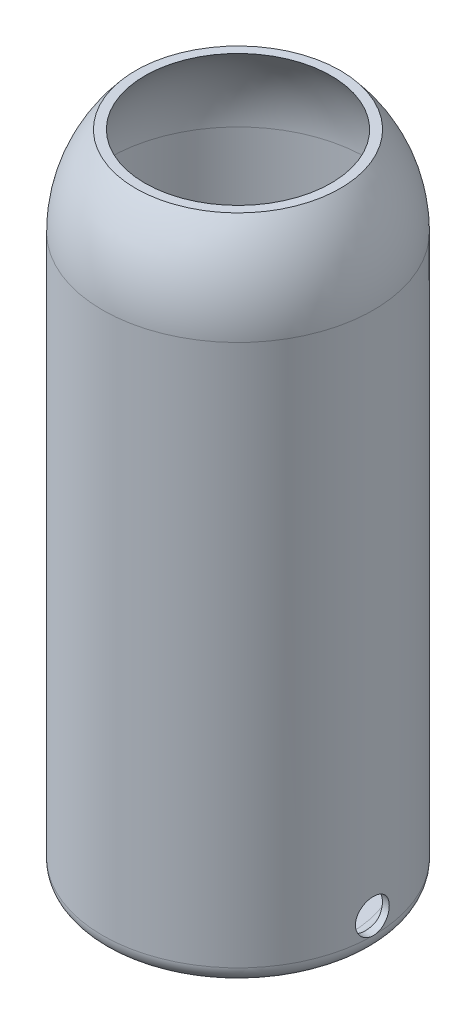
ISO-10303-21;
HEADER;
FILE_DESCRIPTION(('STEP AP214'),'2;1');
FILE_NAME('part.step','',(''),(''),'','','');
FILE_SCHEMA(('AUTOMOTIVE_DESIGN { 1 0 10303 214 1 1 1 1 }'));
ENDSEC;
DATA;
#1=APPLICATION_CONTEXT('core data for automotive mechanical design processes');
#2=APPLICATION_PROTOCOL_DEFINITION('international standard','automotive_design',2000,#1);
#3=PRODUCT_CONTEXT('',#1,'mechanical');
#4=PRODUCT('Part','Part','',(#3));
#5=PRODUCT_RELATED_PRODUCT_CATEGORY('part','',(#4));
#6=PRODUCT_DEFINITION_FORMATION('','',#4);
#7=PRODUCT_DEFINITION_CONTEXT('part definition',#1,'design');
#8=PRODUCT_DEFINITION('design','',#6,#7);
#9=PRODUCT_DEFINITION_SHAPE('','',#8);
#10=(LENGTH_UNIT() NAMED_UNIT(*) SI_UNIT(.MILLI.,.METRE.));
#11=(NAMED_UNIT(*) PLANE_ANGLE_UNIT() SI_UNIT($,.RADIAN.));
#12=(NAMED_UNIT(*) SI_UNIT($,.STERADIAN.) SOLID_ANGLE_UNIT());
#13=UNCERTAINTY_MEASURE_WITH_UNIT(LENGTH_MEASURE(1.E-05),#10,'distance_accuracy_value','');
#14=(GEOMETRIC_REPRESENTATION_CONTEXT(3) GLOBAL_UNCERTAINTY_ASSIGNED_CONTEXT((#13)) GLOBAL_UNIT_ASSIGNED_CONTEXT((#10,
#11,#12)) REPRESENTATION_CONTEXT('',''));
#15=CARTESIAN_POINT('',(0.,0.,0.));
#16=DIRECTION('',(0.,0.,1.));
#17=DIRECTION('',(1.,0.,0.));
#18=AXIS2_PLACEMENT_3D('',#15,#16,#17);
#19=CARTESIAN_POINT('',(0.,7.,-40.0000000000057));
#20=DIRECTION('',(0.,1.,0.));
#21=DIRECTION('',(0.,0.,1.));
#22=AXIS2_PLACEMENT_3D('',#19,#20,#21);
#23=TOROIDAL_SURFACE('',#22,32.9999999999943,5.);
#24=CARTESIAN_POINT('',(0.,2.,-40.0000000000057));
#25=DIRECTION('',(0.,1.,0.));
#26=DIRECTION('',(0.,0.,1.));
#27=AXIS2_PLACEMENT_3D('',#24,#25,#26);
#28=CIRCLE('',#27,32.9999999999943);
#29=CARTESIAN_POINT('',(0.,2.,-7.0000000000114));
#30=VERTEX_POINT('',#29);
#31=EDGE_CURVE('E61',#30,#30,#28,.T.);
#32=ORIENTED_EDGE('',*,*,#31,.F.);
#33=EDGE_LOOP('',(#32));
#34=FACE_BOUND('',#33,.T.);
#35=CARTESIAN_POINT('',(0.,7.00000000000003,-40.0000000000057));
#36=DIRECTION('',(0.,1.,0.));
#37=DIRECTION('',(0.,0.,1.));
#38=AXIS2_PLACEMENT_3D('',#35,#36,#37);
#39=CIRCLE('',#38,37.9999999999943);
#40=CARTESIAN_POINT('',(37.7888872553773,7.00000000000003,-44.));
#41=VERTEX_POINT('',#40);
#42=CARTESIAN_POINT('',(37.7888872553761,7.00000000000003,-36.));
#43=VERTEX_POINT('',#42);
#44=EDGE_CURVE('E79',#41,#43,#39,.T.);
#45=ORIENTED_EDGE('',*,*,#44,.T.);
#46=CARTESIAN_POINT('',(37.7888713741959,7.00020000000003,-35.9998500078122));
#47=CARTESIAN_POINT('',(37.7974636477066,6.89212986952333,-36.0808631003404));
#48=CARTESIAN_POINT('',(37.8027231492097,6.78724744393492,-36.1663872282534));
#49=CARTESIAN_POINT('',(37.8076629477195,6.58475499201194,-36.3456458638186));
#50=CARTESIAN_POINT('',(37.8073478872941,6.48713898215079,-36.4393734747694));
#51=CARTESIAN_POINT('',(37.8022439176968,6.30019884633758,-36.6340469592312));
#52=CARTESIAN_POINT('',(37.797469595738,6.21084872777633,-36.7349683066495));
#53=CARTESIAN_POINT('',(37.7845904562113,6.0406767998743,-36.9435490067326));
#54=CARTESIAN_POINT('',(37.7764849888682,5.95985665826347,-37.0512096704974));
#55=CARTESIAN_POINT('',(37.7489003324683,5.73137171848992,-37.3826349317082));
#56=CARTESIAN_POINT('',(37.726120679697,5.59704765495572,-37.6155061112207));
#57=CARTESIAN_POINT('',(37.6803720865164,5.36734173110734,-38.0999004578518));
#58=CARTESIAN_POINT('',(37.6574030200084,5.2719883847532,-38.3514371236415));
#59=CARTESIAN_POINT('',(37.6278788782295,5.15813841301453,-38.7444915780115));
#60=CARTESIAN_POINT('',(37.6187053868348,5.12463838761585,-38.8816149018344));
#61=CARTESIAN_POINT('',(37.6031450540462,5.06932118818036,-39.1583924456096));
#62=CARTESIAN_POINT('',(37.5967582703431,5.0475042560059,-39.2980467178956));
#63=CARTESIAN_POINT('',(37.5873623289463,5.01577714273133,-39.5787331618629));
#64=CARTESIAN_POINT('',(37.5843513526825,5.00586055063528,-39.719764550336));
#65=CARTESIAN_POINT('',(37.5819721658235,4.99800565727069,-40.002190110072));
#66=CARTESIAN_POINT('',(37.5826038081549,5.0000668723896,-40.1435842664575));
#67=CARTESIAN_POINT('',(37.5873619893581,5.01584957946144,-40.4204215822505));
#68=CARTESIAN_POINT('',(37.5913588153978,5.02913836385651,-40.5558919474949));
#69=CARTESIAN_POINT('',(37.6023392361508,5.06668834511087,-40.8251769940151));
#70=CARTESIAN_POINT('',(37.6093228010816,5.09094943255902,-40.9589916917867));
#71=CARTESIAN_POINT('',(37.6256977063489,5.15026242392142,-41.224137708491));
#72=CARTESIAN_POINT('',(37.6350904977407,5.18532083352894,-41.3554674794092));
#73=CARTESIAN_POINT('',(37.6555000743743,5.26597820279046,-41.6147698696671));
#74=CARTESIAN_POINT('',(37.6665174724404,5.3115811436934,-41.7427412006039));
#75=CARTESIAN_POINT('',(37.6893964859606,5.41372134180095,-41.9962412188708));
#76=CARTESIAN_POINT('',(37.7012676745296,5.47040118558151,-42.1217115934342));
#77=CARTESIAN_POINT('',(37.7246348514896,5.59392570760447,-42.3675807926973));
#78=CARTESIAN_POINT('',(37.7361308387371,5.66077041682109,-42.4879796019415));
#79=CARTESIAN_POINT('',(37.7575807683207,5.804131402911,-42.7227880106334));
#80=CARTESIAN_POINT('',(37.7675369440046,5.88063337450544,-42.8372061218538));
#81=CARTESIAN_POINT('',(37.7847397402229,6.04288558187587,-43.0594415653236));
#82=CARTESIAN_POINT('',(37.7919870253453,6.12863354261817,-43.1672605111498));
#83=CARTESIAN_POINT('',(37.8041303997242,6.33542783054283,-43.406265817076));
#84=CARTESIAN_POINT('',(37.8077078894161,6.45943805780286,-43.5349971780571));
#85=CARTESIAN_POINT('',(37.8062385037104,6.65518631041328,-43.7175544324144));
#86=CARTESIAN_POINT('',(37.8046068961913,6.72209397188603,-43.7766772905431));
#87=CARTESIAN_POINT('',(37.798756640451,6.85893856808518,-43.8912335558526));
#88=CARTESIAN_POINT('',(37.7945368123948,6.92887687080294,-43.9466652676497));
#89=CARTESIAN_POINT('',(37.7888713741971,7.00020000000003,-44.0001499921878));
#90=B_SPLINE_CURVE_WITH_KNOTS('',3,(#46,#47,#48,#49,#50,#51,#52,#53,#54,#55,#56,#57,#58,#59,#60,
#61,#62,#63,#64,#65,#66,#67,#68,#69,#70,#71,#72,#73,#74,#75,#76,#77,#78,#79,#80,#81,#82,#83,#84,
#85,#86,#87,#88,#89),.UNSPECIFIED.,.F.,.F.,(4,2,2,2,2,2,2,2,2,2,2,2,2,2,2,2,2,2,2,2,2,4),(0.,
0.405776089725346,0.811214259738967,1.21533078120645,1.61952616731716,2.42519482205329,
3.23145191484083,3.65536017376119,4.07927720805264,4.50296576549688,4.92663721633098,
5.33468821849916,5.74273515184613,6.15102842765457,6.55947611328122,6.97357632133984,
7.38767779126306,7.80117289762361,8.21456649209159,8.7495554120229,9.01731926374844,
9.28520526587929),.UNSPECIFIED.);
#91=EDGE_CURVE('E72',#43,#41,#90,.T.);
#92=ORIENTED_EDGE('',*,*,#91,.T.);
#93=EDGE_LOOP('',(#45,#92));
#94=FACE_BOUND('',#93,.T.);
#95=ADVANCED_FACE('F46',(#34,#94),#23,.F.);
#96=CARTESIAN_POINT('',(0.,250.694261231748,-40.0000000000056));
#97=DIRECTION('',(0.,1.,0.));
#98=DIRECTION('',(0.,0.,1.));
#99=AXIS2_PLACEMENT_3D('',#96,#97,#98);
#100=CYLINDRICAL_SURFACE('',#99,39.9999999999943);
#101=CARTESIAN_POINT('',(-39.9217985566729,10.,-42.5));
#102=CARTESIAN_POINT('',(-39.921799602833,10.1402788817985,-42.499993827448));
#103=CARTESIAN_POINT('',(-39.9225458845148,10.28065598716,-42.4881534246044));
#104=CARTESIAN_POINT('',(-39.9254507251488,10.5575340360392,-42.4410896775821));
#105=CARTESIAN_POINT('',(-39.927610927892,10.6940302747931,-42.4058391166147));
#106=CARTESIAN_POINT('',(-39.9330979729128,10.9590958977774,-42.3129715250557));
#107=CARTESIAN_POINT('',(-39.936424199287,11.0876694247765,-42.2553663006678));
#108=CARTESIAN_POINT('',(-39.9438677233238,11.3332885735862,-42.1194436803014));
#109=CARTESIAN_POINT('',(-39.9479848397871,11.4503368266574,-42.0411310270185));
#110=CARTESIAN_POINT('',(-39.956553243988,11.6697924113712,-41.8658874742956));
#111=CARTESIAN_POINT('',(-39.9610049674662,11.7721801294309,-41.7689320322458));
#112=CARTESIAN_POINT('',(-39.9697369227487,11.9592403916915,-41.5592057195029));
#113=CARTESIAN_POINT('',(-39.9740171473941,12.0439121969861,-41.4464341894701));
#114=CARTESIAN_POINT('',(-39.9819275579856,12.1931969317838,-41.2081667679007));
#115=CARTESIAN_POINT('',(-39.9855572195541,12.257793710583,-41.0826607383561));
#116=CARTESIAN_POINT('',(-39.9917529455156,12.3649912981832,-40.8225580844402));
#117=CARTESIAN_POINT('',(-39.994319021293,12.4075923424229,-40.6879615573895));
#118=CARTESIAN_POINT('',(-39.9980954365521,12.4695349649899,-40.4136868719104));
#119=CARTESIAN_POINT('',(-39.9993075599067,12.4889071505166,-40.274015650808));
#120=CARTESIAN_POINT('',(-40.0002454975847,12.503936668395,-39.9933990084105));
#121=CARTESIAN_POINT('',(-39.9999713286612,12.4995942680496,-39.8524536014956));
#122=CARTESIAN_POINT('',(-39.9979690642678,12.4673431313152,-39.5734968289894));
#123=CARTESIAN_POINT('',(-39.9962430001633,12.4394673206254,-39.4354816401457));
#124=CARTESIAN_POINT('',(-39.9915336115227,12.3609917491253,-39.1660932743911));
#125=CARTESIAN_POINT('',(-39.9885502795545,12.3103918539848,-39.0347201367489));
#126=CARTESIAN_POINT('',(-39.981658763132,12.1878671768829,-38.7822393915387));
#127=CARTESIAN_POINT('',(-39.9777499319391,12.1159274737385,-38.6611390433377));
#128=CARTESIAN_POINT('',(-39.9694473243126,11.9527761431314,-38.4327207539052));
#129=CARTESIAN_POINT('',(-39.9650535424221,11.8615642987985,-38.3254029677913));
#130=CARTESIAN_POINT('',(-39.9562666518235,11.6622718977895,-38.1274039847105));
#131=CARTESIAN_POINT('',(-39.9518735571142,11.5541627625827,-38.0367515498573));
#132=CARTESIAN_POINT('',(-39.9435908304631,11.324244729276,-37.8748783212513));
#133=CARTESIAN_POINT('',(-39.9397011987216,11.2024358257244,-37.8036575352313));
#134=CARTESIAN_POINT('',(-39.9328646363993,10.9485576855481,-37.6826713519725));
#135=CARTESIAN_POINT('',(-39.929917759051,10.8164878700672,-37.6329071662192));
#136=CARTESIAN_POINT('',(-39.9253009283357,10.5458452694126,-37.5562666659498));
#137=CARTESIAN_POINT('',(-39.9236309599473,10.407272560759,-37.5293900821853));
#138=CARTESIAN_POINT('',(-39.9217590873973,10.1278086353025,-37.4993235481049));
#139=CARTESIAN_POINT('',(-39.9215547052971,9.98692173575661,-37.4960936170429));
#140=CARTESIAN_POINT('',(-39.922630580539,9.70660815420677,-37.5133076141062));
#141=CARTESIAN_POINT('',(-39.923910830156,9.56718146460865,-37.5337514190478));
#142=CARTESIAN_POINT('',(-39.9278094294563,9.29385917926862,-37.5976993517626));
#143=CARTESIAN_POINT('',(-39.9304267106326,9.15995925894541,-37.6411850663114));
#144=CARTESIAN_POINT('',(-39.9367035178708,8.90135796307615,-37.7499637659487));
#145=CARTESIAN_POINT('',(-39.9403630533847,8.77665667096331,-37.8152569488051));
#146=CARTESIAN_POINT('',(-39.9483179814938,8.53980879832428,-37.9658993164845));
#147=CARTESIAN_POINT('',(-39.9526142205528,8.42767928533124,-38.0512752904306));
#148=CARTESIAN_POINT('',(-39.9613554452652,8.21932985034677,-38.2396207390962));
#149=CARTESIAN_POINT('',(-39.9658004323748,8.1231100841631,-38.3425903860943));
#150=CARTESIAN_POINT('',(-39.9743455092934,7.9491764263691,-38.5633723191059));
#151=CARTESIAN_POINT('',(-39.9784451118109,7.8714884068436,-38.6812050087605));
#152=CARTESIAN_POINT('',(-39.9858304686841,7.73700056524372,-38.9282655746196));
#153=CARTESIAN_POINT('',(-39.9891162280594,7.68020061433299,-39.0574933805336));
#154=CARTESIAN_POINT('',(-39.9945013388424,7.58914625208592,-39.3235807593759));
#155=CARTESIAN_POINT('',(-39.9966015517661,7.55487546620897,-39.4604347108513));
#156=CARTESIAN_POINT('',(-39.9993823561911,7.50979866785513,-39.7379677610628));
#157=CARTESIAN_POINT('',(-40.0000629616594,7.49899242451924,-39.8786468221512));
#158=CARTESIAN_POINT('',(-39.9999279052999,7.50115370580714,-40.1595806323996));
#159=CARTESIAN_POINT('',(-39.9991147918468,7.51408074000393,-40.2998356960829));
#160=CARTESIAN_POINT('',(-39.9960887960793,7.56325767558137,-40.5761796721203));
#161=CARTESIAN_POINT('',(-39.9938759113042,7.59950761796505,-40.7122685771495));
#162=CARTESIAN_POINT('',(-39.9882991013604,7.6942922419541,-40.9764232957208));
#163=CARTESIAN_POINT('',(-39.9849351843753,7.75282676512179,-41.104489166297));
#164=CARTESIAN_POINT('',(-39.9774340005925,7.89051331405094,-41.3489806896962));
#165=CARTESIAN_POINT('',(-39.9732967538555,7.96966480501717,-41.4654066443452));
#166=CARTESIAN_POINT('',(-39.9647059053845,8.14648799142732,-41.6835187202857));
#167=CARTESIAN_POINT('',(-39.9602518110711,8.24418893596022,-41.7851811091965));
#168=CARTESIAN_POINT('',(-39.9515331844324,8.45529880764434,-41.9706967968424));
#169=CARTESIAN_POINT('',(-39.9472686987664,8.56871157323784,-42.0545457309796));
#170=CARTESIAN_POINT('',(-39.9394062039911,8.80815537296603,-42.2021164629564));
#171=CARTESIAN_POINT('',(-39.9358090286992,8.93420189448307,-42.2658131493099));
#172=CARTESIAN_POINT('',(-39.9296991361814,9.19513126904179,-42.3710614084228));
#173=CARTESIAN_POINT('',(-39.9271851494566,9.33000356344453,-42.4126389183893));
#174=CARTESIAN_POINT('',(-39.9241851352743,9.55475082862407,-42.4616622176515));
#175=CARTESIAN_POINT('',(-39.9232941676034,9.64317303133093,-42.4760202949809));
#176=CARTESIAN_POINT('',(-39.9221005449983,9.8210501641121,-42.4951911484902));
#177=CARTESIAN_POINT('',(-39.9217978892453,9.91050509274887,-42.5000039379553));
#178=CARTESIAN_POINT('',(-39.9217985566729,10.,-42.5));
#179=B_SPLINE_CURVE_WITH_KNOTS('',3,(#101,#102,#103,#104,#105,#106,#107,#108,#109,#110,#111,
#112,#113,#114,#115,#116,#117,#118,#119,#120,#121,#122,#123,#124,#125,#126,#127,#128,#129,#130,
#131,#132,#133,#134,#135,#136,#137,#138,#139,#140,#141,#142,#143,#144,#145,#146,#147,#148,#149,
#150,#151,#152,#153,#154,#155,#156,#157,#158,#159,#160,#161,#162,#163,#164,#165,#166,#167,#168,
#169,#170,#171,#172,#173,#174,#175,#176,#177,#178),.UNSPECIFIED.,.T.,.F.,(4,2,2,2,2,2,2,2,2,2,2,
2,2,2,2,2,2,2,2,2,2,2,2,2,2,2,2,2,2,2,2,2,2,2,2,2,2,2,4),(0.,0.420509933089563,
0.841509611390613,1.26228724839616,1.68296859656055,2.10420759706282,2.52546416336054,
2.94705876566663,3.36864885519975,3.7896828295314,4.21071205812016,4.63115319721231,
5.05159682171562,5.47233512383409,5.89307816078844,6.31454066185842,6.73600333064839,
7.15748979300387,7.57897129694589,7.9997400131105,8.42050653986419,8.84093733013167,
9.26137193331298,9.68237058123042,10.1033733518384,10.5249604868351,10.9465450214638,
11.3678228022511,11.7890964382225,12.2096520233067,12.6302083477542,13.0507616822093,
13.4713041087787,13.8925152453829,14.3138294671207,14.7356666346089,15.1570080544424,
15.4252847141668,15.6935610005011),.UNSPECIFIED.);
#180=CARTESIAN_POINT('',(-39.9217985566729,10.,-42.5));
#181=VERTEX_POINT('',#180);
#182=EDGE_CURVE('E81',#181,#181,#179,.T.);
#183=ORIENTED_EDGE('',*,*,#182,.T.);
#184=EDGE_LOOP('',(#183));
#185=FACE_BOUND('',#184,.T.);
#186=CARTESIAN_POINT('',(0.,165.,-40.0000000000057));
#187=DIRECTION('',(0.,1.,0.));
#188=DIRECTION('',(0.,0.,1.));
#189=AXIS2_PLACEMENT_3D('',#186,#187,#188);
#190=CIRCLE('',#189,39.9999999999943);
#191=CARTESIAN_POINT('',(0.,165.,-1.13381526389844E-11));
#192=VERTEX_POINT('',#191);
#193=EDGE_CURVE('E106',#192,#192,#190,.T.);
#194=ORIENTED_EDGE('',*,*,#193,.F.);
#195=EDGE_LOOP('',(#194));
#196=FACE_BOUND('',#195,.T.);
#197=CARTESIAN_POINT('',(0.,5.00000000000003,-40.0000000000057));
#198=DIRECTION('',(0.,1.,0.));
#199=DIRECTION('',(0.,0.,1.));
#200=AXIS2_PLACEMENT_3D('',#197,#198,#199);
#201=CIRCLE('',#200,39.9999999999943);
#202=CARTESIAN_POINT('',(39.9999999999943,5.00000000000003,-40.));
#203=VERTEX_POINT('',#202);
#204=EDGE_CURVE('E110',#203,#203,#201,.T.);
#205=ORIENTED_EDGE('',*,*,#204,.T.);
#206=CARTESIAN_POINT('',(39.9999999999943,5.00000000000003,-40.));
#207=CARTESIAN_POINT('',(40.0000005381581,4.9999983945564,-40.1398901199051));
#208=CARTESIAN_POINT('',(39.9992647084898,5.00587286946756,-40.2797566720554));
#209=CARTESIAN_POINT('',(39.9963430990417,5.0293256522657,-40.5585341464732));
#210=CARTESIAN_POINT('',(39.9941569906143,5.04690661296276,-40.6974448449241));
#211=CARTESIAN_POINT('',(39.9883933720941,5.0936632564357,-40.9733745692978));
#212=CARTESIAN_POINT('',(39.9848148259685,5.12284757295465,-41.11039210784));
#213=CARTESIAN_POINT('',(39.976365919031,5.19260668985958,-41.3815095487987));
#214=CARTESIAN_POINT('',(39.9714950850853,5.23318566238794,-41.5156083631121));
#215=CARTESIAN_POINT('',(39.9606049872501,5.32538319705044,-41.7797486795292));
#216=CARTESIAN_POINT('',(39.9545869317666,5.37699014991025,-41.9097942847912));
#217=CARTESIAN_POINT('',(39.9415653040181,5.49091578114955,-42.1651115937155));
#218=CARTESIAN_POINT('',(39.9345613689548,5.55323840471357,-42.2903815182905));
#219=CARTESIAN_POINT('',(39.9197695937746,5.68809882590541,-42.5351574669369));
#220=CARTESIAN_POINT('',(39.9119821851552,5.76063100931265,-42.6546666106878));
#221=CARTESIAN_POINT('',(39.895834417405,5.91545219221618,-42.8872111518514));
#222=CARTESIAN_POINT('',(39.8874738466444,5.99774480384933,-43.0002441294713));
#223=CARTESIAN_POINT('',(39.8703765416477,6.17188491800447,-43.2195068068404));
#224=CARTESIAN_POINT('',(39.861638269667,6.26377417064857,-43.325703230258));
#225=CARTESIAN_POINT('',(39.8440638930822,6.45618755632825,-43.5300274197965));
#226=CARTESIAN_POINT('',(39.8352277534914,6.55671487026917,-43.628152187327));
#227=CARTESIAN_POINT('',(39.817712727716,6.76564129127892,-43.8155748877922));
#228=CARTESIAN_POINT('',(39.809033792602,6.87403789456725,-43.9048756071177));
#229=CARTESIAN_POINT('',(39.7920724042577,7.09801819694039,-44.0740900049766));
#230=CARTESIAN_POINT('',(39.7837900984785,7.21360453273155,-44.1540002082943));
#231=CARTESIAN_POINT('',(39.7678365901099,7.45148132538974,-44.3040546076197));
#232=CARTESIAN_POINT('',(39.7601672998937,7.57379089547263,-44.3741687162924));
#233=CARTESIAN_POINT('',(39.7456849515334,7.82397679510491,-44.5038635981021));
#234=CARTESIAN_POINT('',(39.7388722121937,7.95185517363814,-44.5634404526562));
#235=CARTESIAN_POINT('',(39.7263059358277,8.21219148791936,-44.6715723788149));
#236=CARTESIAN_POINT('',(39.7205519765252,8.34464757278258,-44.7201318463219));
#237=CARTESIAN_POINT('',(39.7102634489607,8.61324144907413,-44.8059145960703));
#238=CARTESIAN_POINT('',(39.7057293285876,8.74938057266938,-44.8431337151316));
#239=CARTESIAN_POINT('',(39.6942156965781,9.16032972480133,-44.9369446836796));
#240=CARTESIAN_POINT('',(39.689242054188,9.439336009762,-44.9763791570848));
#241=CARTESIAN_POINT('',(39.6852781774886,9.99989503088058,-45.0078853709191));
#242=CARTESIAN_POINT('',(39.6862877025628,10.281447664181,-44.9999590159906));
#243=CARTESIAN_POINT('',(39.6941397412139,10.837598360611,-44.9372306806791));
#244=CARTESIAN_POINT('',(39.7009489290516,11.112226945902,-44.8826965097437));
#245=CARTESIAN_POINT('',(39.7195838252941,11.6483930689977,-44.7287017826105));
#246=CARTESIAN_POINT('',(39.7314096353382,11.9099303414457,-44.6292403161599));
#247=CARTESIAN_POINT('',(39.7587823629851,12.4133351837811,-44.3879308464135));
#248=CARTESIAN_POINT('',(39.7743394764714,12.6551463822627,-44.2459664341369));
#249=CARTESIAN_POINT('',(39.8074142163587,13.1116136070717,-43.9237630121956));
#250=CARTESIAN_POINT('',(39.8249319324157,13.3262683906115,-43.7435222518603));
#251=CARTESIAN_POINT('',(39.8601022011184,13.7238853623758,-43.3483982016726));
#252=CARTESIAN_POINT('',(39.8777548486207,13.9066181677098,-43.1332840103647));
#253=CARTESIAN_POINT('',(39.9110926502236,14.2334177758833,-42.6753143435432));
#254=CARTESIAN_POINT('',(39.9267777997874,14.3774844895628,-42.432458804063));
#255=CARTESIAN_POINT('',(39.9544230446036,14.6228626367076,-41.9257233413));
#256=CARTESIAN_POINT('',(39.9663818880865,14.7241597067116,-41.6618363902854));
#257=CARTESIAN_POINT('',(39.9852157155345,14.8809409880974,-41.1206158812521));
#258=CARTESIAN_POINT('',(39.9920909375046,14.9364273442576,-40.8432829533944));
#259=CARTESIAN_POINT('',(39.9999519282168,14.9997148485375,-40.2850263276949));
#260=CARTESIAN_POINT('',(40.0009767228154,15.0078319858304,-40.0041389802552));
#261=CARTESIAN_POINT('',(39.9971267601344,14.9769845307858,-39.445007927147));
#262=CARTESIAN_POINT('',(39.9922521284921,14.9380209411043,-39.1667641653065));
#263=CARTESIAN_POINT('',(39.9771753749948,14.8143805868294,-38.6217509841225));
#264=CARTESIAN_POINT('',(39.966990815771,14.7298544895834,-38.3549468575567));
#265=CARTESIAN_POINT('',(39.9424344624984,14.5176450797849,-37.8393006918772));
#266=CARTESIAN_POINT('',(39.9280625262752,14.3899603018375,-37.590459263011));
#267=CARTESIAN_POINT('',(39.8966364563177,14.0942937864802,-37.1163909526529));
#268=CARTESIAN_POINT('',(39.8795688738166,13.9261076504447,-36.8912924577722));
#269=CARTESIAN_POINT('',(39.8447028535347,13.5545007748665,-36.4724060430885));
#270=CARTESIAN_POINT('',(39.8269043867647,13.3510786367195,-36.2786193667198));
#271=CARTESIAN_POINT('',(39.7924620828631,12.9133860301532,-35.9267359984958));
#272=CARTESIAN_POINT('',(39.7758253956987,12.6789465391907,-35.7688487650326));
#273=CARTESIAN_POINT('',(39.7457083194562,12.1866802785439,-35.4946945349383));
#274=CARTESIAN_POINT('',(39.7322278671072,11.9288539778228,-35.378426703967));
#275=CARTESIAN_POINT('',(39.7099966403285,11.397861393238,-35.1911456739206));
#276=CARTESIAN_POINT('',(39.7012335337219,11.1247371880326,-35.1200143900178));
#277=CARTESIAN_POINT('',(39.6893996880463,10.5701501863967,-35.0246643671297));
#278=CARTESIAN_POINT('',(39.6863286841655,10.2886877785005,-35.0004434457472));
#279=CARTESIAN_POINT('',(39.6862413860416,9.86770509968356,-34.9997879601746));
#280=CARTESIAN_POINT('',(39.6869567678235,9.7279907744482,-35.0054465755111));
#281=CARTESIAN_POINT('',(39.6898435691312,9.44955449545924,-35.0284324015731));
#282=CARTESIAN_POINT('',(39.6920144462624,9.31083219148152,-35.0457552655927));
#283=CARTESIAN_POINT('',(39.6977533828911,9.03531296162439,-35.0919547287318));
#284=CARTESIAN_POINT('',(39.7013219505303,8.89851675475214,-35.1208355299161));
#285=CARTESIAN_POINT('',(39.7097514776531,8.62790627625885,-35.1899221372925));
#286=CARTESIAN_POINT('',(39.7146119670042,8.49409093905429,-35.2301238241107));
#287=CARTESIAN_POINT('',(39.725487362761,8.23033559589058,-35.3215631796439));
#288=CARTESIAN_POINT('',(39.7315022659776,8.10039557922659,-35.3728008178711));
#289=CARTESIAN_POINT('',(39.7445132115149,7.8453429369176,-35.4859211629899));
#290=CARTESIAN_POINT('',(39.7515088975022,7.72022857899442,-35.5478000056116));
#291=CARTESIAN_POINT('',(39.7662882864746,7.47559939211026,-35.6817991415469));
#292=CARTESIAN_POINT('',(39.7740722778147,7.35608663571801,-35.7539231863748));
#293=CARTESIAN_POINT('',(39.7902044419981,7.12357551708683,-35.907859374918));
#294=CARTESIAN_POINT('',(39.7985524114312,7.0105748330965,-35.989668033603));
#295=CARTESIAN_POINT('',(39.8156417227854,6.79104567958635,-36.1630335336909));
#296=CARTESIAN_POINT('',(39.8243854215816,6.68456841212606,-36.2546549873604));
#297=CARTESIAN_POINT('',(39.841960696589,6.47973821996232,-36.4464891994091));
#298=CARTESIAN_POINT('',(39.8507922397924,6.38138236389898,-36.5466988311021));
#299=CARTESIAN_POINT('',(39.8683029909226,6.19338064270289,-36.7551032322268));
#300=CARTESIAN_POINT('',(39.8769821036451,6.10374007275867,-36.8633027867628));
#301=CARTESIAN_POINT('',(39.8939349862871,5.93389762896735,-37.0868388154233));
#302=CARTESIAN_POINT('',(39.9022089047514,5.85369228080548,-37.2021726384881));
#303=CARTESIAN_POINT('',(39.9181553288762,5.70293478465746,-37.4397069981362));
#304=CARTESIAN_POINT('',(39.9258251726399,5.63242444117215,-37.5619342525752));
#305=CARTESIAN_POINT('',(39.9403041894249,5.50198932448173,-37.8119031126484));
#306=CARTESIAN_POINT('',(39.9471136779349,5.44206066779111,-37.9396426737554));
#307=CARTESIAN_POINT('',(39.9596765836276,5.33323718014392,-38.1996747152884));
#308=CARTESIAN_POINT('',(39.9654308239856,5.28433374177418,-38.3319635504343));
#309=CARTESIAN_POINT('',(39.9757248289596,5.19787412284101,-38.6001979816258));
#310=CARTESIAN_POINT('',(39.9802648800188,5.16031526567186,-38.7361427068558));
#311=CARTESIAN_POINT('',(39.9893293227786,5.08590951421732,-39.0579116522458));
#312=CARTESIAN_POINT('',(39.9933140899263,5.05372660808125,-39.2448491022419));
#313=CARTESIAN_POINT('',(39.9986490545519,5.01077301660132,-39.6212054440075));
#314=CARTESIAN_POINT('',(39.9999992714573,5.00000217336284,-39.8106243174685));
#315=CARTESIAN_POINT('',(39.9999999999943,5.00000000000003,-40.));
#316=B_SPLINE_CURVE_WITH_KNOTS('',3,(#206,#207,#208,#209,#210,#211,#212,#213,#214,#215,#216,
#217,#218,#219,#220,#221,#222,#223,#224,#225,#226,#227,#228,#229,#230,#231,#232,#233,#234,#235,
#236,#237,#238,#239,#240,#241,#242,#243,#244,#245,#246,#247,#248,#249,#250,#251,#252,#253,#254,
#255,#256,#257,#258,#259,#260,#261,#262,#263,#264,#265,#266,#267,#268,#269,#270,#271,#272,#273,
#274,#275,#276,#277,#278,#279,#280,#281,#282,#283,#284,#285,#286,#287,#288,#289,#290,#291,#292,
#293,#294,#295,#296,#297,#298,#299,#300,#301,#302,#303,#304,#305,#306,#307,#308,#309,#310,#311,
#312,#313,#314,#315),.UNSPECIFIED.,.T.,.F.,(4,2,2,2,2,2,2,2,2,2,2,2,2,2,2,2,2,2,2,2,2,2,2,2,2,2,
2,2,2,2,2,2,2,2,2,2,2,2,2,2,2,2,2,2,2,2,2,2,2,2,2,2,2,2,4),(0.,0.419504637823986,
0.839104372080566,1.25901690519858,1.67908338982056,2.09870982539646,2.51849108679862,
2.9380424064698,3.35774948092475,3.77936522319636,4.20113689336966,4.62277495120617,
5.04456855951588,5.4676304353004,5.89084930960147,6.31389902278676,6.73710385606687,
7.57817257185716,8.41920746382402,9.2554419949646,10.0916934694556,10.9302565918414,
11.7688580764036,12.6132576288591,13.457659128393,14.3023439807629,15.1469892842064,
15.9859936539692,16.8249801561693,17.6612091439986,18.4974665277097,19.3380361246992,
20.1786390936325,21.0240274962822,21.8693989505615,22.7125495517493,23.5556609263432,
23.9747450940195,24.3936731755013,24.8127537032621,25.2316819351985,25.6506090098185,
26.0693842743662,26.4883132802117,26.9070919891522,27.3288208308205,27.7503967812447,
28.1722272905916,28.5939019805888,29.0173414250535,29.4406251425126,29.8635772481612,
30.2864294856974,30.8543363757693,31.4222390780256),.UNSPECIFIED.);
#317=EDGE_CURVE('E66',#203,#203,#316,.T.);
#318=ORIENTED_EDGE('',*,*,#317,.F.);
#319=EDGE_LOOP('',(#205,#318));
#320=FACE_BOUND('',#319,.T.);
#321=ADVANCED_FACE('F143',(#185,#196,#320),#100,.T.);
#322=CARTESIAN_POINT('',(0.,250.694261231748,-40.0000000000056));
#323=DIRECTION('',(0.,1.,0.));
#324=DIRECTION('',(0.,0.,1.));
#325=AXIS2_PLACEMENT_3D('',#322,#323,#324);
#326=CYLINDRICAL_SURFACE('',#325,37.9999999999943);
#327=CARTESIAN_POINT('',(-37.9176739792883,10.,-42.5));
#328=CARTESIAN_POINT('',(-37.9176750792124,10.1402629682193,-42.4999938339611));
#329=CARTESIAN_POINT('',(-37.9184606296433,10.2806237709643,-42.4881561059976));
#330=CARTESIAN_POINT('',(-37.9215182656339,10.5574685707728,-42.4411036053276));
#331=CARTESIAN_POINT('',(-37.9237920750402,10.6939478803918,-42.4058617229528));
#332=CARTESIAN_POINT('',(-37.9295675678204,10.9589795567314,-42.3130185364016));
#333=CARTESIAN_POINT('',(-37.9330685962991,11.0875361084282,-42.255429156032));
#334=CARTESIAN_POINT('',(-37.9409032159588,11.3331246599597,-42.1195452946128));
#335=CARTESIAN_POINT('',(-37.9452366181997,11.4501592660541,-42.0412555108224));
#336=CARTESIAN_POINT('',(-37.9542557951883,11.6696081452173,-41.8660519173292));
#337=CARTESIAN_POINT('',(-37.9589420743451,11.7720008591413,-41.7691111277086));
#338=CARTESIAN_POINT('',(-37.9681342909266,11.9590747717131,-41.5594132656095));
#339=CARTESIAN_POINT('',(-37.972640220774,12.0437552268142,-41.4466555294798));
#340=CARTESIAN_POINT('',(-37.9809684480335,12.1930678587299,-41.2084019381859));
#341=CARTESIAN_POINT('',(-37.9847901323648,12.257682093999,-41.0828948158581));
#342=CARTESIAN_POINT('',(-37.9913139259275,12.3649132672503,-40.8227840989038));
#343=CARTESIAN_POINT('',(-37.9940160481975,12.4075304614169,-40.6881806102369));
#344=CARTESIAN_POINT('',(-37.9979927668003,12.4694977026685,-40.4139066499443));
#345=CARTESIAN_POINT('',(-37.9992694434793,12.488881660215,-40.2742438704122));
#346=CARTESIAN_POINT('',(-38.0002584328175,12.5039369246699,-39.9936415126118));
#347=CARTESIAN_POINT('',(-37.9999707647044,12.4996085230303,-39.852701950058));
#348=CARTESIAN_POINT('',(-37.9978652114878,12.4673898748629,-39.5737765060392));
#349=CARTESIAN_POINT('',(-37.9960496953067,12.4395361040845,-39.4357863909024));
#350=CARTESIAN_POINT('',(-37.9910955429243,12.3611140034818,-39.1664444776855));
#351=CARTESIAN_POINT('',(-37.9879568982274,12.3105455278108,-39.0350927222351));
#352=CARTESIAN_POINT('',(-37.9807057592291,12.1880882578919,-38.7826391745589));
#353=CARTESIAN_POINT('',(-37.9765925116141,12.1161829605724,-38.6615454099663));
#354=CARTESIAN_POINT('',(-37.9678549875716,11.9531051772264,-38.4331329122184));
#355=CARTESIAN_POINT('',(-37.9632307047518,11.8619324501749,-38.3258143514104));
#356=CARTESIAN_POINT('',(-37.9539810952335,11.6627019182125,-38.1277856938957));
#357=CARTESIAN_POINT('',(-37.9493557831576,11.5546124487481,-38.0371074501952));
#358=CARTESIAN_POINT('',(-37.940634326532,11.3247275505096,-37.875179109668));
#359=CARTESIAN_POINT('',(-37.9365381822182,11.2029321156279,-37.803929021499));
#360=CARTESIAN_POINT('',(-37.929337691072,10.949072071377,-37.6828816428813));
#361=CARTESIAN_POINT('',(-37.9262334082677,10.817006799737,-37.6330857373048));
#362=CARTESIAN_POINT('',(-37.9213689519798,10.5463654056999,-37.5563824595098));
#363=CARTESIAN_POINT('',(-37.9196087609658,10.4077893682445,-37.5294747887713));
#364=CARTESIAN_POINT('',(-37.9176342832776,10.128338078964,-37.4993515641759));
#365=CARTESIAN_POINT('',(-37.9174171062476,9.98746762163631,-37.4960917132568));
#366=CARTESIAN_POINT('',(-37.9185455955548,9.70718195966926,-37.5132408843004));
#367=CARTESIAN_POINT('',(-37.9198912528682,9.56776674663202,-37.5336497695995));
#368=CARTESIAN_POINT('',(-37.9239911291727,9.29447458963023,-37.5975202644017));
#369=CARTESIAN_POINT('',(-37.9267440992399,9.16059284864236,-37.6409614351018));
#370=CARTESIAN_POINT('',(-37.9333473147889,8.90201991033478,-37.7496426523808));
#371=CARTESIAN_POINT('',(-37.9371975712952,8.77732880537022,-37.8148829179785));
#372=CARTESIAN_POINT('',(-37.9455684924558,8.54047329315668,-37.9654234366527));
#373=CARTESIAN_POINT('',(-37.9500901446264,8.42832777185079,-38.0507533485349));
#374=CARTESIAN_POINT('',(-37.9592908826903,8.2199371644284,-38.2390078366942));
#375=CARTESIAN_POINT('',(-37.963969970286,8.12369225031853,-38.3419326032812));
#376=CARTESIAN_POINT('',(-37.9729667977767,7.94968505238056,-38.5626459006222));
#377=CARTESIAN_POINT('',(-37.9772839703056,7.87195144974817,-38.6804570694907));
#378=CARTESIAN_POINT('',(-37.9850623602978,7.73736978207066,-38.927485248377));
#379=CARTESIAN_POINT('',(-37.988523583502,7.68052157694181,-39.0567021818861));
#380=CARTESIAN_POINT('',(-37.9941973852501,7.58937421754079,-39.3227688248362));
#381=CARTESIAN_POINT('',(-37.9964109655475,7.5550569691244,-39.4596123134894));
#382=CARTESIAN_POINT('',(-37.9993440696192,7.50988645918505,-39.7371339070451));
#383=CARTESIAN_POINT('',(-38.0000636099764,7.49903293723148,-39.877811969369));
#384=CARTESIAN_POINT('',(-37.9999276075619,7.50110055747898,-40.1587256617555));
#385=CARTESIAN_POINT('',(-37.9990750367096,7.51397684082435,-40.2989616256359));
#386=CARTESIAN_POINT('',(-37.9958965684007,7.56304547667955,-40.5752756062674));
#387=CARTESIAN_POINT('',(-37.9935706684204,7.59923786912852,-40.7113536158957));
#388=CARTESIAN_POINT('',(-37.9877069032411,7.69390102988966,-40.9754950957724));
#389=CARTESIAN_POINT('',(-37.9841690532897,7.75237151792081,-41.103558666827));
#390=CARTESIAN_POINT('',(-37.9762784096888,7.88992509973381,-41.3480573780508));
#391=CARTESIAN_POINT('',(-37.9719256360221,7.96900768809972,-41.4644928032495));
#392=CARTESIAN_POINT('',(-37.9628848382144,8.14570703189953,-41.6826580285111));
#393=CARTESIAN_POINT('',(-37.9581962336788,8.24335638147089,-41.7843614046743));
#394=CARTESIAN_POINT('',(-37.949016916461,8.4543704305946,-41.9699683346993));
#395=CARTESIAN_POINT('',(-37.9445262524154,8.56773896450327,-42.0538675329415));
#396=CARTESIAN_POINT('',(-37.9362446369068,8.80711518088459,-42.2015536329165));
#397=CARTESIAN_POINT('',(-37.9324546219288,8.93313943689143,-42.2653136962135));
#398=CARTESIAN_POINT('',(-37.9260153222117,9.19403856300581,-42.3706908155276));
#399=CARTESIAN_POINT('',(-37.9233647055077,9.32890288518926,-42.4123337401371));
#400=CARTESIAN_POINT('',(-37.9201971892414,9.55382362159435,-42.4615011542208));
#401=CARTESIAN_POINT('',(-37.9192552304777,9.64242708929919,-42.4759194805029));
#402=CARTESIAN_POINT('',(-37.9179932743445,9.82067370674051,-42.4951708671761));
#403=CARTESIAN_POINT('',(-37.9176732760047,9.91031685485476,-42.5000039425214));
#404=CARTESIAN_POINT('',(-37.9176739792883,10.,-42.5));
#405=B_SPLINE_CURVE_WITH_KNOTS('',3,(#327,#328,#329,#330,#331,#332,#333,#334,#335,#336,#337,
#338,#339,#340,#341,#342,#343,#344,#345,#346,#347,#348,#349,#350,#351,#352,#353,#354,#355,#356,
#357,#358,#359,#360,#361,#362,#363,#364,#365,#366,#367,#368,#369,#370,#371,#372,#373,#374,#375,
#376,#377,#378,#379,#380,#381,#382,#383,#384,#385,#386,#387,#388,#389,#390,#391,#392,#393,#394,
#395,#396,#397,#398,#399,#400,#401,#402,#403,#404),.UNSPECIFIED.,.T.,.F.,(4,2,2,2,2,2,2,2,2,2,2,
2,2,2,2,2,2,2,2,2,2,2,2,2,2,2,2,2,2,2,2,2,2,2,2,2,2,2,4),(0.,0.420461498480438,
0.841410880410042,1.26213596730298,1.68276566662256,2.10400847286644,2.52526895900484,
2.94690502397212,3.36853617832337,3.78955118149473,4.21056100991941,4.63091926439618,
5.05128021794908,5.4719671530415,5.89265935100816,6.31414862675711,6.73563809033018,
7.15715475706391,7.57866592607822,7.99938731660344,8.42010627789134,8.8404525173781,
9.26080298027821,9.68177795124707,10.1027574758629,10.524385077836,10.9460098517929,
11.3672956121168,11.7885766964457,12.2090622072308,12.6295484382853,13.0500293793715,
13.4705000110872,13.8917157147231,14.3130343462041,14.7349121022704,15.1562953299902,
15.4251358436647,15.6939759379172),.UNSPECIFIED.);
#406=CARTESIAN_POINT('',(-37.9176739792883,10.,-42.5));
#407=VERTEX_POINT('',#406);
#408=EDGE_CURVE('E50',#407,#407,#405,.T.);
#409=ORIENTED_EDGE('',*,*,#408,.F.);
#410=EDGE_LOOP('',(#409));
#411=FACE_BOUND('',#410,.T.);
#412=CARTESIAN_POINT('',(0.,165.,-40.0000000000057));
#413=DIRECTION('',(0.,1.,0.));
#414=DIRECTION('',(0.,0.,1.));
#415=AXIS2_PLACEMENT_3D('',#412,#413,#414);
#416=CIRCLE('',#415,37.9999999999943);
#417=CARTESIAN_POINT('',(0.,165.,-2.00000000001134));
#418=VERTEX_POINT('',#417);
#419=EDGE_CURVE('E85',#418,#418,#416,.T.);
#420=ORIENTED_EDGE('',*,*,#419,.T.);
#421=EDGE_LOOP('',(#420));
#422=FACE_BOUND('',#421,.T.);
#423=ORIENTED_EDGE('',*,*,#44,.F.);
#424=CARTESIAN_POINT('',(37.7888872553773,7.00000000000003,-44.));
#425=CARTESIAN_POINT('',(37.7799921031505,7.11199765066209,-44.0840161103466));
#426=CARTESIAN_POINT('',(37.7713168060162,7.22755145252419,-44.1633134844796));
#427=CARTESIAN_POINT('',(37.754637096774,7.46493379026336,-44.31196156135));
#428=CARTESIAN_POINT('',(37.7466326804956,7.58676228712542,-44.3813123259237));
#429=CARTESIAN_POINT('',(37.7315290335804,7.83580440090662,-44.5095315187019));
#430=CARTESIAN_POINT('',(37.7244294158904,7.9630156839545,-44.568404433407));
#431=CARTESIAN_POINT('',(37.7113331990979,8.22197693715121,-44.6752809084428));
#432=CARTESIAN_POINT('',(37.7053365738755,8.35372679973383,-44.7232847261718));
#433=CARTESIAN_POINT('',(37.6946158574189,8.62090931354386,-44.8080936294879));
#434=CARTESIAN_POINT('',(37.6898924261334,8.75634383479389,-44.8448929085788));
#435=CARTESIAN_POINT('',(37.6818571821871,9.0299174680224,-44.906997215034));
#436=CARTESIAN_POINT('',(37.6785458914132,9.16805756020986,-44.9322979931074));
#437=CARTESIAN_POINT('',(37.6734354711847,9.4459066244972,-44.9711814322397));
#438=CARTESIAN_POINT('',(37.6716352866982,9.58561443286489,-44.98477226918));
#439=CARTESIAN_POINT('',(37.6695951954556,9.86574126912886,-45.0001658596606));
#440=CARTESIAN_POINT('',(37.6693558621625,10.0061605394589,-45.0019642806208));
#441=CARTESIAN_POINT('',(37.6704428570466,10.2858525978678,-44.9937712578201));
#442=CARTESIAN_POINT('',(37.6717603355143,10.4251273778291,-44.9838464549473));
#443=CARTESIAN_POINT('',(37.6759091159354,10.7023883722413,-44.9523856395603));
#444=CARTESIAN_POINT('',(37.6787409745261,10.8403740938885,-44.9308453575471));
#445=CARTESIAN_POINT('',(37.6858367737462,11.114000270051,-44.8763163544961));
#446=CARTESIAN_POINT('',(37.6901004526488,11.2496411484259,-44.8433297257331));
#447=CARTESIAN_POINT('',(37.6999397394863,11.5176969542599,-44.7661364315619));
#448=CARTESIAN_POINT('',(37.7055158336068,11.6501106661025,-44.7219256076601));
#449=CARTESIAN_POINT('',(37.717820852531,11.9107483416075,-44.6226066506987));
#450=CARTESIAN_POINT('',(37.724549915826,12.0389717997435,-44.5674972084069));
#451=CARTESIAN_POINT('',(37.7389722614322,12.2903675726119,-44.4467593112373));
#452=CARTESIAN_POINT('',(37.7466658975744,12.4135380116438,-44.3811269938128));
#453=CARTESIAN_POINT('',(37.762795289771,12.6538803360765,-44.2398515639295));
#454=CARTESIAN_POINT('',(37.7712307503195,12.7710545809011,-44.1642124316851));
#455=CARTESIAN_POINT('',(37.7886130433735,12.9986936052607,-44.0034069199766));
#456=CARTESIAN_POINT('',(37.7975600646326,13.1091558768237,-43.9182370126466));
#457=CARTESIAN_POINT('',(37.8157804832537,13.3233606945865,-43.7383112602859));
#458=CARTESIAN_POINT('',(37.8250557990554,13.427047758395,-43.64348943493));
#459=CARTESIAN_POINT('',(37.8436090073475,13.6260957669697,-43.4454573440906));
#460=CARTESIAN_POINT('',(37.8528868995177,13.7214536097157,-43.3422439807761));
#461=CARTESIAN_POINT('',(37.8803218437807,13.9939246538984,-43.0211226460092));
#462=CARTESIAN_POINT('',(37.898099974411,14.1576584822119,-42.7915456923761));
#463=CARTESIAN_POINT('',(37.930657327632,14.444692062767,-42.3074313019969));
#464=CARTESIAN_POINT('',(37.9454277573961,14.5678738932241,-42.0528238183832));
#465=CARTESIAN_POINT('',(37.9702496388758,14.7696886642867,-41.5262718063043));
#466=CARTESIAN_POINT('',(37.9803013325065,14.8483238887035,-41.2543281674228));
#467=CARTESIAN_POINT('',(37.9944976853905,14.9583108784476,-40.7026893286474));
#468=CARTESIAN_POINT('',(37.9986792724468,14.9899583090065,-40.4230539745733));
#469=CARTESIAN_POINT('',(38.0007846017065,15.0059663185572,-39.8624120321751));
#470=CARTESIAN_POINT('',(37.9987085656553,14.9903285731494,-39.5814054927928));
#471=CARTESIAN_POINT('',(37.988562225793,14.9124651084732,-39.0276668896825));
#472=CARTESIAN_POINT('',(37.9805258020171,14.8505026919788,-38.7548970912505));
#473=CARTESIAN_POINT('',(37.9593899245426,14.6821150253904,-38.2236463967463));
#474=CARTESIAN_POINT('',(37.9462903535937,14.5756887456168,-37.9651658317366));
#475=CARTESIAN_POINT('',(37.9164216511284,14.3210001116527,-37.468771439992));
#476=CARTESIAN_POINT('',(37.8996390277189,14.1725833425962,-37.2309378395546));
#477=CARTESIAN_POINT('',(37.8642785850989,13.8381102600092,-36.7833468319083));
#478=CARTESIAN_POINT('',(37.8457006740421,13.6520520202212,-36.5735908624518));
#479=CARTESIAN_POINT('',(37.8179829136325,13.3481559569952,-36.2838543930902));
#480=CARTESIAN_POINT('',(37.8087301616913,13.2422270970571,-36.1910904092229));
#481=CARTESIAN_POINT('',(37.7905561879767,13.0229222700271,-36.014815452743));
#482=CARTESIAN_POINT('',(37.7816348460196,12.909549044694,-35.9313011036014));
#483=CARTESIAN_POINT('',(37.7643738120301,12.6760954222515,-35.7740876397052));
#484=CARTESIAN_POINT('',(37.7560343449112,12.5560124635557,-35.7003923104191));
#485=CARTESIAN_POINT('',(37.740181820215,12.3100593872029,-35.5633988580165));
#486=CARTESIAN_POINT('',(37.7326684528092,12.1841914644833,-35.5000968324699));
#487=CARTESIAN_POINT('',(37.718680578333,11.9275077731793,-35.384316001627));
#488=CARTESIAN_POINT('',(37.7122061324504,11.7966917137318,-35.3318378337561));
#489=CARTESIAN_POINT('',(37.7004863000109,11.531097329568,-35.238113381297));
#490=CARTESIAN_POINT('',(37.6952404507012,11.3963205182723,-35.1968628668432));
#491=CARTESIAN_POINT('',(37.6861262476906,11.1236884255395,-35.1258671191325));
#492=CARTESIAN_POINT('',(37.6822582320622,10.9858323973753,-35.09612470941));
#493=CARTESIAN_POINT('',(37.6760158720317,10.7081203619075,-35.048393361613));
#494=CARTESIAN_POINT('',(37.6736409598701,10.5682651355233,-35.0303999558243));
#495=CARTESIAN_POINT('',(37.6704640849242,10.2885698004476,-35.0063759172586));
#496=CARTESIAN_POINT('',(37.669650469616,10.1487374303243,-35.0002566595376));
#497=CARTESIAN_POINT('',(37.6695844502039,9.86910369952522,-34.9997592556279));
#498=CARTESIAN_POINT('',(37.670331460375,9.729302346903,-35.0053767044865));
#499=CARTESIAN_POINT('',(37.673365134096,9.4505656386549,-35.0283108635303));
#500=CARTESIAN_POINT('',(37.6756530438414,9.31163107590233,-35.0456370431365));
#501=CARTESIAN_POINT('',(37.6817024827844,9.03578550189203,-35.0918598245273));
#502=CARTESIAN_POINT('',(37.6854634710808,8.89887376699716,-35.1207521794013));
#503=CARTESIAN_POINT('',(37.6943425326674,8.62824264938591,-35.1898284961534));
#504=CARTESIAN_POINT('',(37.6994581085606,8.49451788054532,-35.2299916865224));
#505=CARTESIAN_POINT('',(37.7109013059656,8.23098871903066,-35.3213209456859));
#506=CARTESIAN_POINT('',(37.7172284711685,8.10118287165125,-35.3724828730217));
#507=CARTESIAN_POINT('',(37.7309055305433,7.84654315394015,-35.4853578815025));
#508=CARTESIAN_POINT('',(37.7382538554821,7.72170202581398,-35.5470548060044));
#509=CARTESIAN_POINT('',(37.7537710962014,7.47769058396326,-35.6805926759649));
#510=CARTESIAN_POINT('',(37.7619395311314,7.35851700693069,-35.7524276871264));
#511=CARTESIAN_POINT('',(37.7734172097024,7.2012952618048,-35.8563656393481));
#512=CARTESIAN_POINT('',(37.7764693500311,7.16041101166773,-35.8842757908053));
#513=CARTESIAN_POINT('',(37.7826344619617,7.07953960706981,-35.9412620781096));
#514=CARTESIAN_POINT('',(37.7857473585071,7.03955146244338,-35.9703368168781));
#515=CARTESIAN_POINT('',(37.7888872553761,7.00000000000004,-36.));
#516=B_SPLINE_CURVE_WITH_KNOTS('',3,(#424,#425,#426,#427,#428,#429,#430,#431,#432,#433,#434,
#435,#436,#437,#438,#439,#440,#441,#442,#443,#444,#445,#446,#447,#448,#449,#450,#451,#452,#453,
#454,#455,#456,#457,#458,#459,#460,#461,#462,#463,#464,#465,#466,#467,#468,#469,#470,#471,#472,
#473,#474,#475,#476,#477,#478,#479,#480,#481,#482,#483,#484,#485,#486,#487,#488,#489,#490,#491,
#492,#493,#494,#495,#496,#497,#498,#499,#500,#501,#502,#503,#504,#505,#506,#507,#508,#509,#510,
#511,#512,#513,#514,#515),.UNSPECIFIED.,.F.,.F.,(4,2,2,2,2,2,2,2,2,2,2,2,2,2,2,2,2,2,2,2,2,2,2,
2,2,2,2,2,2,2,2,2,2,2,2,2,2,2,2,2,2,2,2,2,2,4),(0.,0.420746070294421,0.841489524774411,
1.26205238578721,1.68260528613412,2.10337575891908,2.52430160197116,2.94493331586989,
3.36571956285999,3.78412530851227,4.20268495240265,4.62116812814467,5.03980657610743,
5.45849534496456,5.87733815185398,6.29601486192878,6.71484706322124,7.13676395284396,
7.55883731129518,8.40211822187352,9.24783009607721,10.0934986084799,10.9338229590123,
11.7741175321085,12.6096719602741,13.4452457390068,14.2839330931814,15.1226633770424,
15.5455782482596,15.9683382242914,16.3912607157688,16.8140240452882,17.2368122645639,
17.6594409829716,18.0821733284516,18.5047448306036,18.9241500721981,19.3433979333236,
19.762985267043,20.182418676252,20.6010841134386,21.0195921818106,21.4374640911483,
21.855092407229,22.0038656004814,22.1524653730926),.UNSPECIFIED.);
#517=EDGE_CURVE('E11',#41,#43,#516,.T.);
#518=ORIENTED_EDGE('',*,*,#517,.T.);
#519=EDGE_LOOP('',(#423,#518));
#520=FACE_BOUND('',#519,.T.);
#521=ADVANCED_FACE('F83',(#411,#422,#520),#326,.F.);
#522=CARTESIAN_POINT('',(0.,1.99999999999999,0.));
#523=DIRECTION('',(0.,1.,0.));
#524=DIRECTION('',(0.,0.,1.));
#525=AXIS2_PLACEMENT_3D('',#522,#523,#524);
#526=PLANE('',#525);
#527=ORIENTED_EDGE('',*,*,#31,.T.);
#528=EDGE_LOOP('',(#527));
#529=FACE_BOUND('',#528,.T.);
#530=ADVANCED_FACE('F158',(#529),#526,.T.);
#531=CARTESIAN_POINT('',(0.,0.,0.));
#532=DIRECTION('',(0.,1.,0.));
#533=DIRECTION('',(0.,0.,1.));
#534=AXIS2_PLACEMENT_3D('',#531,#532,#533);
#535=PLANE('',#534);
#536=CARTESIAN_POINT('',(0.,0.,-40.0000000000057));
#537=DIRECTION('',(0.,1.,0.));
#538=DIRECTION('',(0.,0.,1.));
#539=AXIS2_PLACEMENT_3D('',#536,#537,#538);
#540=CIRCLE('',#539,34.9999999999943);
#541=CARTESIAN_POINT('',(0.,0.,-5.0000000000114));
#542=VERTEX_POINT('',#541);
#543=EDGE_CURVE('E114',#542,#542,#540,.T.);
#544=ORIENTED_EDGE('',*,*,#543,.F.);
#545=EDGE_LOOP('',(#544));
#546=FACE_BOUND('',#545,.T.);
#547=ADVANCED_FACE('F155',(#546),#535,.F.);
#548=CARTESIAN_POINT('',(0.,5.,-40.0000000000057));
#549=DIRECTION('',(0.,1.,0.));
#550=DIRECTION('',(0.,0.,1.));
#551=AXIS2_PLACEMENT_3D('',#548,#549,#550);
#552=TOROIDAL_SURFACE('',#551,34.9999999999943,5.);
#553=ORIENTED_EDGE('',*,*,#204,.F.);
#554=EDGE_LOOP('',(#553));
#555=FACE_BOUND('',#554,.T.);
#556=ORIENTED_EDGE('',*,*,#543,.T.);
#557=EDGE_LOOP('',(#556));
#558=FACE_BOUND('',#557,.T.);
#559=ADVANCED_FACE('F151',(#555,#558),#552,.T.);
#560=CARTESIAN_POINT('',(0.,165.,-40.));
#561=DIRECTION('',(0.,1.,0.));
#562=DIRECTION('',(0.,0.,-1.));
#563=AXIS2_PLACEMENT_3D('',#560,#561,#562);
#564=SPHERICAL_SURFACE('',#563,40.);
#565=CARTESIAN_POINT('',(0.,191.224988083881,-40.0000000000057));
#566=DIRECTION('',(0.,1.,0.));
#567=DIRECTION('',(0.,0.,1.));
#568=AXIS2_PLACEMENT_3D('',#565,#566,#567);
#569=CIRCLE('',#568,30.2034766210774);
#570=CARTESIAN_POINT('',(0.,191.224988083881,-9.79652337892825));
#571=VERTEX_POINT('',#570);
#572=EDGE_CURVE('E102',#571,#571,#569,.T.);
#573=ORIENTED_EDGE('',*,*,#572,.F.);
#574=EDGE_LOOP('',(#573));
#575=FACE_BOUND('',#574,.T.);
#576=ORIENTED_EDGE('',*,*,#193,.T.);
#577=EDGE_LOOP('',(#576));
#578=FACE_BOUND('',#577,.T.);
#579=ADVANCED_FACE('F149',(#575,#578),#564,.T.);
#580=CARTESIAN_POINT('',(0.,191.224988083881,0.));
#581=DIRECTION('',(0.,-1.,0.));
#582=DIRECTION('',(0.,0.,-1.));
#583=AXIS2_PLACEMENT_3D('',#580,#581,#582);
#584=PLANE('',#583);
#585=CARTESIAN_POINT('',(0.,191.224988083881,-40.0000000000057));
#586=DIRECTION('',(0.,1.,0.));
#587=DIRECTION('',(0.,0.,1.));
#588=AXIS2_PLACEMENT_3D('',#585,#586,#587);
#589=CIRCLE('',#588,27.5);
#590=CARTESIAN_POINT('',(0.,191.224988083881,-12.5000000000056));
#591=VERTEX_POINT('',#590);
#592=EDGE_CURVE('E90',#591,#591,#589,.T.);
#593=ORIENTED_EDGE('',*,*,#592,.F.);
#594=EDGE_LOOP('',(#593));
#595=FACE_BOUND('',#594,.T.);
#596=ORIENTED_EDGE('',*,*,#572,.T.);
#597=EDGE_LOOP('',(#596));
#598=FACE_BOUND('',#597,.T.);
#599=ADVANCED_FACE('F202',(#595,#598),#584,.F.);
#600=CARTESIAN_POINT('',(0.,165.,-40.));
#601=DIRECTION('',(0.,1.,0.));
#602=DIRECTION('',(0.,0.,-1.));
#603=AXIS2_PLACEMENT_3D('',#600,#601,#602);
#604=SPHERICAL_SURFACE('',#603,38.);
#605=ORIENTED_EDGE('',*,*,#592,.T.);
#606=EDGE_LOOP('',(#605));
#607=FACE_BOUND('',#606,.T.);
#608=ORIENTED_EDGE('',*,*,#419,.F.);
#609=EDGE_LOOP('',(#608));
#610=FACE_BOUND('',#609,.T.);
#611=ADVANCED_FACE('F129',(#607,#610),#604,.F.);
#612=CARTESIAN_POINT('',(50.,10.,-40.));
#613=DIRECTION('',(-1.,0.,0.));
#614=DIRECTION('',(0.,0.,1.));
#615=AXIS2_PLACEMENT_3D('',#612,#613,#614);
#616=CYLINDRICAL_SURFACE('',#615,5.);
#617=ORIENTED_EDGE('',*,*,#517,.F.);
#618=ORIENTED_EDGE('',*,*,#91,.F.);
#619=EDGE_LOOP('',(#617,#618));
#620=FACE_BOUND('',#619,.T.);
#621=ORIENTED_EDGE('',*,*,#317,.T.);
#622=EDGE_LOOP('',(#621));
#623=FACE_BOUND('',#622,.T.);
#624=ADVANCED_FACE('F74',(#620,#623),#616,.F.);
#625=CARTESIAN_POINT('',(-50.,10.,-40.));
#626=DIRECTION('',(1.,0.,0.));
#627=DIRECTION('',(0.,0.,-1.));
#628=AXIS2_PLACEMENT_3D('',#625,#626,#627);
#629=CYLINDRICAL_SURFACE('',#628,2.5);
#630=ORIENTED_EDGE('',*,*,#408,.T.);
#631=EDGE_LOOP('',(#630));
#632=FACE_BOUND('',#631,.T.);
#633=ORIENTED_EDGE('',*,*,#182,.F.);
#634=EDGE_LOOP('',(#633));
#635=FACE_BOUND('',#634,.T.);
#636=ADVANCED_FACE('F128',(#632,#635),#629,.F.);
#637=CLOSED_SHELL('',(#95,#321,#521,#530,#547,#559,#579,#599,#611,#624,#636));
#638=MANIFOLD_SOLID_BREP('B2',#637);
#639=ADVANCED_BREP_SHAPE_REPRESENTATION('',(#18,#638),#14);
#640=SHAPE_DEFINITION_REPRESENTATION(#9,#639);
ENDSEC;
END-ISO-10303-21;
